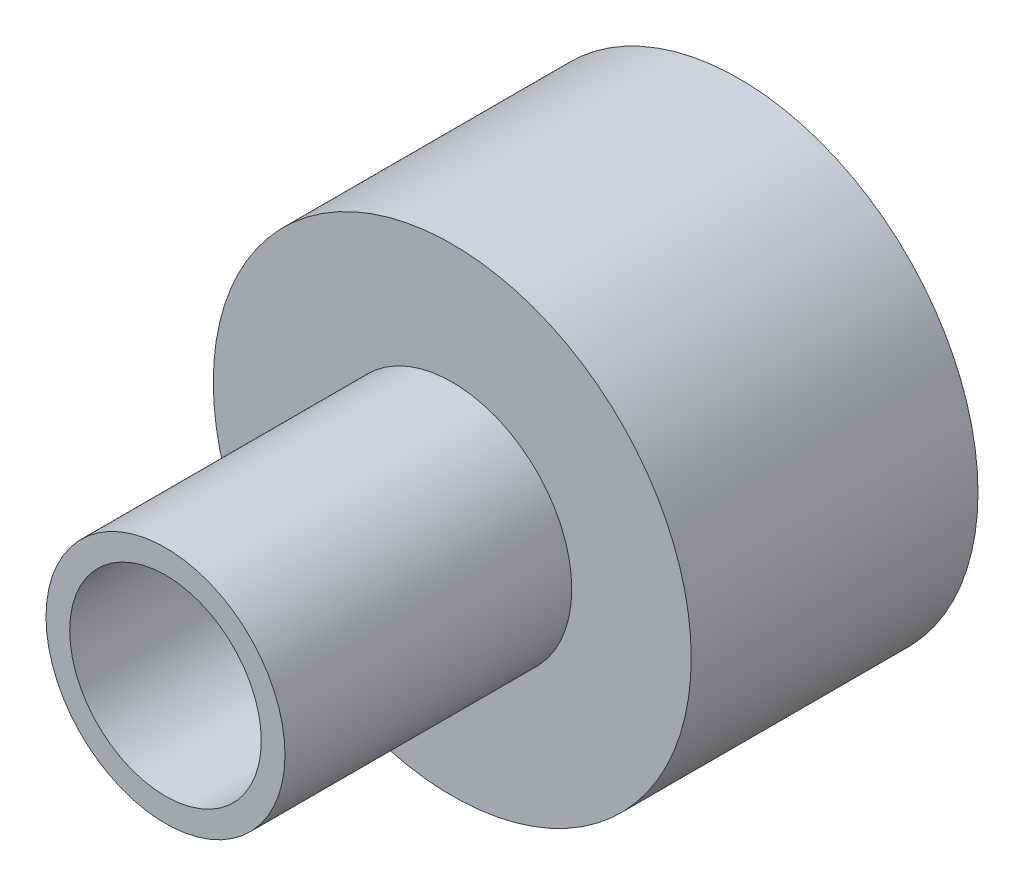
ISO-10303-21;
HEADER;
FILE_DESCRIPTION(('STEP AP214'),'2;1');
FILE_NAME('part.step','',(''),(''),'','','');
FILE_SCHEMA(('AUTOMOTIVE_DESIGN { 1 0 10303 214 1 1 1 1 }'));
ENDSEC;
DATA;
#1=APPLICATION_CONTEXT('core data for automotive mechanical design processes');
#2=APPLICATION_PROTOCOL_DEFINITION('international standard','automotive_design',2000,#1);
#3=PRODUCT_CONTEXT('',#1,'mechanical');
#4=PRODUCT('Part','Part','',(#3));
#5=PRODUCT_RELATED_PRODUCT_CATEGORY('part','',(#4));
#6=PRODUCT_DEFINITION_FORMATION('','',#4);
#7=PRODUCT_DEFINITION_CONTEXT('part definition',#1,'design');
#8=PRODUCT_DEFINITION('design','',#6,#7);
#9=PRODUCT_DEFINITION_SHAPE('','',#8);
#10=(LENGTH_UNIT() NAMED_UNIT(*) SI_UNIT(.MILLI.,.METRE.));
#11=(NAMED_UNIT(*) PLANE_ANGLE_UNIT() SI_UNIT($,.RADIAN.));
#12=(NAMED_UNIT(*) SI_UNIT($,.STERADIAN.) SOLID_ANGLE_UNIT());
#13=UNCERTAINTY_MEASURE_WITH_UNIT(LENGTH_MEASURE(1.E-05),#10,'distance_accuracy_value','');
#14=(GEOMETRIC_REPRESENTATION_CONTEXT(3) GLOBAL_UNCERTAINTY_ASSIGNED_CONTEXT((#13)) GLOBAL_UNIT_ASSIGNED_CONTEXT((#10,
#11,#12)) REPRESENTATION_CONTEXT('',''));
#15=CARTESIAN_POINT('',(0.,0.,0.));
#16=DIRECTION('',(0.,0.,1.));
#17=DIRECTION('',(1.,0.,0.));
#18=AXIS2_PLACEMENT_3D('',#15,#16,#17);
#19=CARTESIAN_POINT('',(0.,0.,6.));
#20=DIRECTION('',(0.,0.,1.));
#21=DIRECTION('',(1.,0.,0.));
#22=AXIS2_PLACEMENT_3D('',#19,#20,#21);
#23=PLANE('',#22);
#24=CARTESIAN_POINT('',(0.,0.,6.));
#25=DIRECTION('',(0.,0.,1.));
#26=DIRECTION('',(1.,0.,0.));
#27=AXIS2_PLACEMENT_3D('',#24,#25,#26);
#28=CIRCLE('',#27,5.);
#29=CARTESIAN_POINT('',(5.,0.,6.));
#30=VERTEX_POINT('',#29);
#31=EDGE_CURVE('E11',#30,#30,#28,.T.);
#32=ORIENTED_EDGE('',*,*,#31,.T.);
#33=EDGE_LOOP('',(#32));
#34=FACE_BOUND('',#33,.T.);
#35=CARTESIAN_POINT('',(0.,0.,6.));
#36=DIRECTION('',(0.,0.,1.));
#37=DIRECTION('',(1.,0.,0.));
#38=AXIS2_PLACEMENT_3D('',#35,#36,#37);
#39=CIRCLE('',#38,2.5);
#40=CARTESIAN_POINT('',(2.5,0.,6.));
#41=VERTEX_POINT('',#40);
#42=EDGE_CURVE('E71',#41,#41,#39,.T.);
#43=ORIENTED_EDGE('',*,*,#42,.F.);
#44=EDGE_LOOP('',(#43));
#45=FACE_BOUND('',#44,.T.);
#46=ADVANCED_FACE('F42',(#34,#45),#23,.T.);
#47=CARTESIAN_POINT('',(0.,0.,0.));
#48=DIRECTION('',(0.,0.,1.));
#49=DIRECTION('',(1.,0.,0.));
#50=AXIS2_PLACEMENT_3D('',#47,#48,#49);
#51=PLANE('',#50);
#52=CARTESIAN_POINT('',(0.,0.,0.));
#53=DIRECTION('',(0.,0.,1.));
#54=DIRECTION('',(1.,0.,0.));
#55=AXIS2_PLACEMENT_3D('',#52,#53,#54);
#56=CIRCLE('',#55,5.);
#57=CARTESIAN_POINT('',(5.,0.,0.));
#58=VERTEX_POINT('',#57);
#59=EDGE_CURVE('E52',#58,#58,#56,.T.);
#60=ORIENTED_EDGE('',*,*,#59,.F.);
#61=EDGE_LOOP('',(#60));
#62=FACE_BOUND('',#61,.T.);
#63=CARTESIAN_POINT('',(0.,0.,0.));
#64=DIRECTION('',(0.,0.,1.));
#65=DIRECTION('',(1.,0.,0.));
#66=AXIS2_PLACEMENT_3D('',#63,#64,#65);
#67=CIRCLE('',#66,2.);
#68=CARTESIAN_POINT('',(2.,0.,0.));
#69=VERTEX_POINT('',#68);
#70=EDGE_CURVE('E57',#69,#69,#67,.T.);
#71=ORIENTED_EDGE('',*,*,#70,.T.);
#72=EDGE_LOOP('',(#71));
#73=FACE_BOUND('',#72,.T.);
#74=ADVANCED_FACE('F103',(#62,#73),#51,.F.);
#75=CARTESIAN_POINT('',(0.,0.,6.));
#76=DIRECTION('',(0.,0.,-1.));
#77=DIRECTION('',(-1.,0.,0.));
#78=AXIS2_PLACEMENT_3D('',#75,#76,#77);
#79=CYLINDRICAL_SURFACE('',#78,5.);
#80=ORIENTED_EDGE('',*,*,#31,.F.);
#81=EDGE_LOOP('',(#80));
#82=FACE_BOUND('',#81,.T.);
#83=ORIENTED_EDGE('',*,*,#59,.T.);
#84=EDGE_LOOP('',(#83));
#85=FACE_BOUND('',#84,.T.);
#86=ADVANCED_FACE('F44',(#82,#85),#79,.T.);
#87=CARTESIAN_POINT('',(0.,0.,6.));
#88=DIRECTION('',(0.,0.,-1.));
#89=DIRECTION('',(-1.,0.,0.));
#90=AXIS2_PLACEMENT_3D('',#87,#88,#89);
#91=CYLINDRICAL_SURFACE('',#90,2.);
#92=CARTESIAN_POINT('',(0.,0.,6.));
#93=DIRECTION('',(0.,0.,1.));
#94=DIRECTION('',(1.,0.,0.));
#95=AXIS2_PLACEMENT_3D('',#92,#93,#94);
#96=CIRCLE('',#95,2.);
#97=CARTESIAN_POINT('',(2.,0.,6.));
#98=VERTEX_POINT('',#97);
#99=EDGE_CURVE('E64',#98,#98,#96,.T.);
#100=ORIENTED_EDGE('',*,*,#99,.T.);
#101=EDGE_LOOP('',(#100));
#102=FACE_BOUND('',#101,.T.);
#103=ORIENTED_EDGE('',*,*,#70,.F.);
#104=EDGE_LOOP('',(#103));
#105=FACE_BOUND('',#104,.T.);
#106=ADVANCED_FACE('F65',(#102,#105),#91,.F.);
#107=CARTESIAN_POINT('',(0.,0.,12.));
#108=DIRECTION('',(0.,0.,1.));
#109=DIRECTION('',(1.,0.,0.));
#110=AXIS2_PLACEMENT_3D('',#107,#108,#109);
#111=PLANE('',#110);
#112=CARTESIAN_POINT('',(0.,0.,12.));
#113=DIRECTION('',(0.,0.,1.));
#114=DIRECTION('',(1.,0.,0.));
#115=AXIS2_PLACEMENT_3D('',#112,#113,#114);
#116=CIRCLE('',#115,2.5);
#117=CARTESIAN_POINT('',(2.5,0.,12.));
#118=VERTEX_POINT('',#117);
#119=EDGE_CURVE('E76',#118,#118,#116,.T.);
#120=ORIENTED_EDGE('',*,*,#119,.T.);
#121=EDGE_LOOP('',(#120));
#122=FACE_BOUND('',#121,.T.);
#123=CARTESIAN_POINT('',(0.,0.,12.));
#124=DIRECTION('',(0.,0.,1.));
#125=DIRECTION('',(1.,0.,0.));
#126=AXIS2_PLACEMENT_3D('',#123,#124,#125);
#127=CIRCLE('',#126,2.00419923523627);
#128=CARTESIAN_POINT('',(2.00419923523627,0.,12.));
#129=VERTEX_POINT('',#128);
#130=EDGE_CURVE('E69',#129,#129,#127,.T.);
#131=ORIENTED_EDGE('',*,*,#130,.F.);
#132=EDGE_LOOP('',(#131));
#133=FACE_BOUND('',#132,.T.);
#134=ADVANCED_FACE('F93',(#122,#133),#111,.T.);
#135=CARTESIAN_POINT('',(0.,0.,12.));
#136=DIRECTION('',(0.,0.,-1.));
#137=DIRECTION('',(-1.,0.,0.));
#138=AXIS2_PLACEMENT_3D('',#135,#136,#137);
#139=CYLINDRICAL_SURFACE('',#138,2.5);
#140=ORIENTED_EDGE('',*,*,#119,.F.);
#141=EDGE_LOOP('',(#140));
#142=FACE_BOUND('',#141,.T.);
#143=ORIENTED_EDGE('',*,*,#42,.T.);
#144=EDGE_LOOP('',(#143));
#145=FACE_BOUND('',#144,.T.);
#146=ADVANCED_FACE('F92',(#142,#145),#139,.T.);
#147=CARTESIAN_POINT('',(0.,0.,12.));
#148=DIRECTION('',(0.,0.,-1.));
#149=DIRECTION('',(-1.,0.,0.));
#150=AXIS2_PLACEMENT_3D('',#147,#148,#149);
#151=CYLINDRICAL_SURFACE('',#150,2.00419923523627);
#152=ORIENTED_EDGE('',*,*,#130,.T.);
#153=EDGE_LOOP('',(#152));
#154=FACE_BOUND('',#153,.T.);
#155=ORIENTED_EDGE('',*,*,#99,.F.);
#156=EDGE_LOOP('',(#155));
#157=FACE_BOUND('',#156,.T.);
#158=ADVANCED_FACE('F83',(#154,#157),#151,.F.);
#159=CLOSED_SHELL('',(#46,#74,#86,#106,#134,#146,#158));
#160=MANIFOLD_SOLID_BREP('B2',#159);
#161=ADVANCED_BREP_SHAPE_REPRESENTATION('',(#18,#160),#14);
#162=SHAPE_DEFINITION_REPRESENTATION(#9,#161);
ENDSEC;
END-ISO-10303-21;
